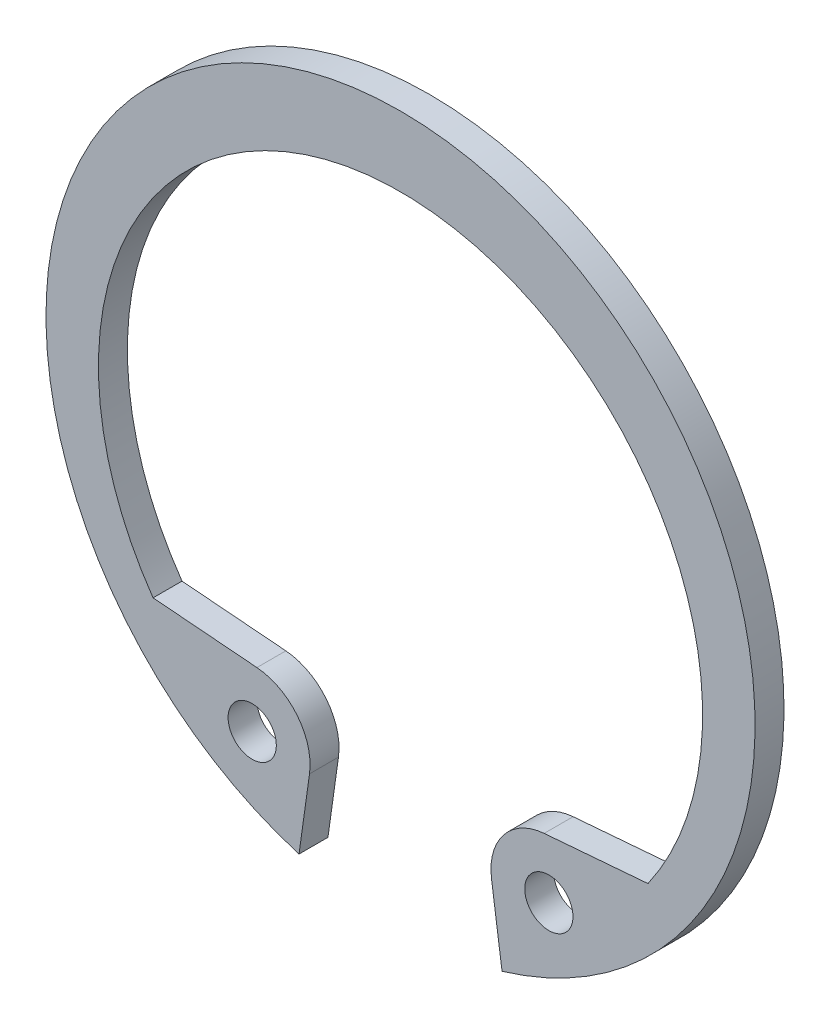
ISO-10303-21;
HEADER;
FILE_DESCRIPTION(('STEP AP214'),'2;1');
FILE_NAME('part.step','',(''),(''),'','','');
FILE_SCHEMA(('AUTOMOTIVE_DESIGN { 1 0 10303 214 1 1 1 1 }'));
ENDSEC;
DATA;
#1=APPLICATION_CONTEXT('core data for automotive mechanical design processes');
#2=APPLICATION_PROTOCOL_DEFINITION('international standard','automotive_design',2000,#1);
#3=PRODUCT_CONTEXT('',#1,'mechanical');
#4=PRODUCT('Part','Part','',(#3));
#5=PRODUCT_RELATED_PRODUCT_CATEGORY('part','',(#4));
#6=PRODUCT_DEFINITION_FORMATION('','',#4);
#7=PRODUCT_DEFINITION_CONTEXT('part definition',#1,'design');
#8=PRODUCT_DEFINITION('design','',#6,#7);
#9=PRODUCT_DEFINITION_SHAPE('','',#8);
#10=(LENGTH_UNIT() NAMED_UNIT(*) SI_UNIT(.MILLI.,.METRE.));
#11=(NAMED_UNIT(*) PLANE_ANGLE_UNIT() SI_UNIT($,.RADIAN.));
#12=(NAMED_UNIT(*) SI_UNIT($,.STERADIAN.) SOLID_ANGLE_UNIT());
#13=UNCERTAINTY_MEASURE_WITH_UNIT(LENGTH_MEASURE(1.E-05),#10,'distance_accuracy_value','');
#14=(GEOMETRIC_REPRESENTATION_CONTEXT(3) GLOBAL_UNCERTAINTY_ASSIGNED_CONTEXT((#13)) GLOBAL_UNIT_ASSIGNED_CONTEXT((#10,
#11,#12)) REPRESENTATION_CONTEXT('',''));
#15=CARTESIAN_POINT('',(0.,0.,0.));
#16=DIRECTION('',(0.,0.,1.));
#17=DIRECTION('',(1.,0.,0.));
#18=AXIS2_PLACEMENT_3D('',#15,#16,#17);
#19=CARTESIAN_POINT('',(-5.95496087519933,-8.26005064882796,1.2));
#20=DIRECTION('',(-0.08126630200028,-0.996692424050268,0.));
#21=DIRECTION('',(0.996692424050268,-0.08126630200028,0.));
#22=AXIS2_PLACEMENT_3D('',#19,#20,#21);
#23=PLANE('',#22);
#24=DIRECTION('',(-0.996692424050268,0.08126630200028,0.));
#25=VECTOR('',#24,1.);
#26=CARTESIAN_POINT('',(-5.95496087519933,-8.26005064882796,0.));
#27=LINE('',#26,#25);
#28=CARTESIAN_POINT('',(-5.95496087519933,-8.26005064882795,0.));
#29=VERTEX_POINT('',#28);
#30=CARTESIAN_POINT('',(-10.2598793547196,-7.90904486529684,0.));
#31=VERTEX_POINT('',#30);
#32=EDGE_CURVE('E98',#29,#31,#27,.T.);
#33=ORIENTED_EDGE('',*,*,#32,.T.);
#34=DIRECTION('',(0.,0.,-1.));
#35=VECTOR('',#34,1.);
#36=CARTESIAN_POINT('',(-10.2598793547196,-7.90904486529684,1.2));
#37=LINE('',#36,#35);
#38=CARTESIAN_POINT('',(-10.2598793547196,-7.90904486529684,1.2));
#39=VERTEX_POINT('',#38);
#40=EDGE_CURVE('E11',#39,#31,#37,.T.);
#41=ORIENTED_EDGE('',*,*,#40,.F.);
#42=DIRECTION('',(-0.996692424050268,0.08126630200028,0.));
#43=VECTOR('',#42,1.);
#44=CARTESIAN_POINT('',(-5.95496087519933,-8.26005064882796,1.2));
#45=LINE('',#44,#43);
#46=CARTESIAN_POINT('',(-5.95496087519933,-8.26005064882795,1.2));
#47=VERTEX_POINT('',#46);
#48=EDGE_CURVE('E118',#47,#39,#45,.T.);
#49=ORIENTED_EDGE('',*,*,#48,.F.);
#50=DIRECTION('',(0.,0.,-1.));
#51=VECTOR('',#50,1.);
#52=CARTESIAN_POINT('',(-5.95496087519933,-8.26005064882795,1.2));
#53=LINE('',#52,#51);
#54=EDGE_CURVE('E133',#47,#29,#53,.T.);
#55=ORIENTED_EDGE('',*,*,#54,.T.);
#56=EDGE_LOOP('',(#33,#41,#49,#55));
#57=FACE_BOUND('',#56,.T.);
#58=ADVANCED_FACE('F17',(#57),#23,.F.);
#59=CARTESIAN_POINT('',(0.,-0.725,1.2));
#60=DIRECTION('',(0.,0.,-1.));
#61=DIRECTION('',(-1.,0.,0.));
#62=AXIS2_PLACEMENT_3D('',#59,#60,#61);
#63=CYLINDRICAL_SURFACE('',#62,12.525);
#64=CARTESIAN_POINT('',(0.,-0.725,0.));
#65=DIRECTION('',(0.,0.,1.));
#66=DIRECTION('',(1.,0.,0.));
#67=AXIS2_PLACEMENT_3D('',#64,#65,#66);
#68=CIRCLE('',#67,12.525);
#69=CARTESIAN_POINT('',(10.2598793547196,-7.90904486529686,0.));
#70=VERTEX_POINT('',#69);
#71=EDGE_CURVE('E92',#70,#31,#68,.T.);
#72=ORIENTED_EDGE('',*,*,#71,.F.);
#73=DIRECTION('',(0.,0.,-1.));
#74=VECTOR('',#73,1.);
#75=CARTESIAN_POINT('',(10.2598793547196,-7.90904486529686,1.2));
#76=LINE('',#75,#74);
#77=CARTESIAN_POINT('',(10.2598793547196,-7.90904486529686,1.2));
#78=VERTEX_POINT('',#77);
#79=EDGE_CURVE('E20',#78,#70,#76,.T.);
#80=ORIENTED_EDGE('',*,*,#79,.F.);
#81=CARTESIAN_POINT('',(0.,-0.725,1.2));
#82=DIRECTION('',(0.,0.,1.));
#83=DIRECTION('',(1.,0.,0.));
#84=AXIS2_PLACEMENT_3D('',#81,#82,#83);
#85=CIRCLE('',#84,12.525);
#86=EDGE_CURVE('E121',#78,#39,#85,.T.);
#87=ORIENTED_EDGE('',*,*,#86,.T.);
#88=ORIENTED_EDGE('',*,*,#40,.T.);
#89=EDGE_LOOP('',(#72,#80,#87,#88));
#90=FACE_BOUND('',#89,.T.);
#91=ADVANCED_FACE('F93',(#90),#63,.F.);
#92=CARTESIAN_POINT('',(5.95496087519933,-8.26005064882795,1.2));
#93=DIRECTION('',(-0.0812663020002773,0.996692424050268,0.));
#94=DIRECTION('',(-0.996692424050268,-0.0812663020002773,0.));
#95=AXIS2_PLACEMENT_3D('',#92,#93,#94);
#96=PLANE('',#95);
#97=DIRECTION('',(0.996692424050268,0.0812663020002773,0.));
#98=VECTOR('',#97,1.);
#99=CARTESIAN_POINT('',(5.95496087519933,-8.26005064882795,0.));
#100=LINE('',#99,#98);
#101=CARTESIAN_POINT('',(5.95496087519933,-8.26005064882795,0.));
#102=VERTEX_POINT('',#101);
#103=EDGE_CURVE('E84',#102,#70,#100,.T.);
#104=ORIENTED_EDGE('',*,*,#103,.F.);
#105=DIRECTION('',(0.,0.,-1.));
#106=VECTOR('',#105,1.);
#107=CARTESIAN_POINT('',(5.95496087519933,-8.26005064882795,1.2));
#108=LINE('',#107,#106);
#109=CARTESIAN_POINT('',(5.95496087519933,-8.26005064882795,1.2));
#110=VERTEX_POINT('',#109);
#111=EDGE_CURVE('E90',#110,#102,#108,.T.);
#112=ORIENTED_EDGE('',*,*,#111,.F.);
#113=DIRECTION('',(0.996692424050268,0.0812663020002773,0.));
#114=VECTOR('',#113,1.);
#115=CARTESIAN_POINT('',(5.95496087519933,-8.26005064882795,1.2));
#116=LINE('',#115,#114);
#117=EDGE_CURVE('E86',#110,#78,#116,.T.);
#118=ORIENTED_EDGE('',*,*,#117,.T.);
#119=ORIENTED_EDGE('',*,*,#79,.T.);
#120=EDGE_LOOP('',(#104,#112,#118,#119));
#121=FACE_BOUND('',#120,.T.);
#122=ADVANCED_FACE('F82',(#121),#96,.T.);
#123=CARTESIAN_POINT('',(6.15,-10.6521124665486,1.2));
#124=DIRECTION('',(0.,0.,-1.));
#125=DIRECTION('',(-1.,0.,0.));
#126=AXIS2_PLACEMENT_3D('',#123,#124,#125);
#127=CYLINDRICAL_SURFACE('',#126,2.4);
#128=CARTESIAN_POINT('',(6.15,-10.6521124665486,0.));
#129=DIRECTION('',(0.,0.,1.));
#130=DIRECTION('',(1.,0.,0.));
#131=AXIS2_PLACEMENT_3D('',#128,#129,#130);
#132=CIRCLE('',#131,2.4);
#133=CARTESIAN_POINT('',(3.77335663502023,-10.9861279088527,0.));
#134=VERTEX_POINT('',#133);
#135=EDGE_CURVE('E103',#102,#134,#132,.T.);
#136=ORIENTED_EDGE('',*,*,#135,.T.);
#137=DIRECTION('',(0.,0.,-1.));
#138=VECTOR('',#137,1.);
#139=CARTESIAN_POINT('',(3.77335663502023,-10.9861279088527,1.2));
#140=LINE('',#139,#138);
#141=CARTESIAN_POINT('',(3.77335663502023,-10.9861279088527,1.2));
#142=VERTEX_POINT('',#141);
#143=EDGE_CURVE('E143',#142,#134,#140,.T.);
#144=ORIENTED_EDGE('',*,*,#143,.F.);
#145=CARTESIAN_POINT('',(6.15,-10.6521124665486,1.2));
#146=DIRECTION('',(0.,0.,1.));
#147=DIRECTION('',(1.,0.,0.));
#148=AXIS2_PLACEMENT_3D('',#145,#146,#147);
#149=CIRCLE('',#148,2.4);
#150=EDGE_CURVE('E124',#110,#142,#149,.T.);
#151=ORIENTED_EDGE('',*,*,#150,.F.);
#152=ORIENTED_EDGE('',*,*,#111,.T.);
#153=EDGE_LOOP('',(#136,#144,#151,#152));
#154=FACE_BOUND('',#153,.T.);
#155=ADVANCED_FACE('F148',(#154),#127,.T.);
#156=CARTESIAN_POINT('',(3.77335663502023,-10.9861279088527,1.2));
#157=DIRECTION('',(0.99026806874157,0.139173100960064,0.));
#158=DIRECTION('',(-0.139173100960064,0.990268068741571,0.));
#159=AXIS2_PLACEMENT_3D('',#156,#157,#158);
#160=PLANE('',#159);
#161=DIRECTION('',(0.139173100960064,-0.990268068741571,0.));
#162=VECTOR('',#161,1.);
#163=CARTESIAN_POINT('',(3.77335663502023,-10.9861279088527,0.));
#164=LINE('',#163,#162);
#165=CARTESIAN_POINT('',(4.20881796120529,-14.0845962444592,0.));
#166=VERTEX_POINT('',#165);
#167=EDGE_CURVE('E105',#134,#166,#164,.T.);
#168=ORIENTED_EDGE('',*,*,#167,.T.);
#169=DIRECTION('',(0.,0.,-1.));
#170=VECTOR('',#169,1.);
#171=CARTESIAN_POINT('',(4.20881796120529,-14.0845962444592,1.2));
#172=LINE('',#171,#170);
#173=CARTESIAN_POINT('',(4.20881796120529,-14.0845962444592,1.2));
#174=VERTEX_POINT('',#173);
#175=EDGE_CURVE('E140',#174,#166,#172,.T.);
#176=ORIENTED_EDGE('',*,*,#175,.F.);
#177=DIRECTION('',(0.139173100960064,-0.990268068741571,0.));
#178=VECTOR('',#177,1.);
#179=CARTESIAN_POINT('',(3.77335663502023,-10.9861279088527,1.2));
#180=LINE('',#179,#178);
#181=EDGE_CURVE('E126',#142,#174,#180,.T.);
#182=ORIENTED_EDGE('',*,*,#181,.F.);
#183=ORIENTED_EDGE('',*,*,#143,.T.);
#184=EDGE_LOOP('',(#168,#176,#182,#183));
#185=FACE_BOUND('',#184,.T.);
#186=ADVANCED_FACE('F164',(#185),#160,.F.);
#187=CARTESIAN_POINT('',(0.,0.,1.2));
#188=DIRECTION('',(0.,0.,-1.));
#189=DIRECTION('',(-1.,0.,0.));
#190=AXIS2_PLACEMENT_3D('',#187,#188,#189);
#191=CYLINDRICAL_SURFACE('',#190,14.7);
#192=CARTESIAN_POINT('',(0.,0.,0.));
#193=DIRECTION('',(0.,0.,1.));
#194=DIRECTION('',(1.,0.,0.));
#195=AXIS2_PLACEMENT_3D('',#192,#193,#194);
#196=CIRCLE('',#195,14.7);
#197=CARTESIAN_POINT('',(-4.20881796120528,-14.0845962444593,0.));
#198=VERTEX_POINT('',#197);
#199=EDGE_CURVE('E110',#166,#198,#196,.T.);
#200=ORIENTED_EDGE('',*,*,#199,.T.);
#201=DIRECTION('',(0.,0.,-1.));
#202=VECTOR('',#201,1.);
#203=CARTESIAN_POINT('',(-4.20881796120528,-14.0845962444593,1.2));
#204=LINE('',#203,#202);
#205=CARTESIAN_POINT('',(-4.20881796120528,-14.0845962444593,1.2));
#206=VERTEX_POINT('',#205);
#207=EDGE_CURVE('E138',#206,#198,#204,.T.);
#208=ORIENTED_EDGE('',*,*,#207,.F.);
#209=CARTESIAN_POINT('',(0.,0.,1.2));
#210=DIRECTION('',(0.,0.,1.));
#211=DIRECTION('',(1.,0.,0.));
#212=AXIS2_PLACEMENT_3D('',#209,#210,#211);
#213=CIRCLE('',#212,14.7);
#214=EDGE_CURVE('E128',#174,#206,#213,.T.);
#215=ORIENTED_EDGE('',*,*,#214,.F.);
#216=ORIENTED_EDGE('',*,*,#175,.T.);
#217=EDGE_LOOP('',(#200,#208,#215,#216));
#218=FACE_BOUND('',#217,.T.);
#219=ADVANCED_FACE('F161',(#218),#191,.T.);
#220=CARTESIAN_POINT('',(-3.77335663502023,-10.9861279088527,1.2));
#221=DIRECTION('',(0.99026806874157,-0.139173100960067,0.));
#222=DIRECTION('',(0.139173100960067,0.99026806874157,0.));
#223=AXIS2_PLACEMENT_3D('',#220,#221,#222);
#224=PLANE('',#223);
#225=DIRECTION('',(-0.139173100960067,-0.99026806874157,0.));
#226=VECTOR('',#225,1.);
#227=CARTESIAN_POINT('',(-3.77335663502023,-10.9861279088527,0.));
#228=LINE('',#227,#226);
#229=CARTESIAN_POINT('',(-3.77335663502023,-10.9861279088527,0.));
#230=VERTEX_POINT('',#229);
#231=EDGE_CURVE('E113',#230,#198,#228,.T.);
#232=ORIENTED_EDGE('',*,*,#231,.F.);
#233=DIRECTION('',(0.,0.,-1.));
#234=VECTOR('',#233,1.);
#235=CARTESIAN_POINT('',(-3.77335663502023,-10.9861279088527,1.2));
#236=LINE('',#235,#234);
#237=CARTESIAN_POINT('',(-3.77335663502023,-10.9861279088527,1.2));
#238=VERTEX_POINT('',#237);
#239=EDGE_CURVE('E39',#238,#230,#236,.T.);
#240=ORIENTED_EDGE('',*,*,#239,.F.);
#241=DIRECTION('',(-0.139173100960067,-0.99026806874157,0.));
#242=VECTOR('',#241,1.);
#243=CARTESIAN_POINT('',(-3.77335663502023,-10.9861279088527,1.2));
#244=LINE('',#243,#242);
#245=EDGE_CURVE('E130',#238,#206,#244,.T.);
#246=ORIENTED_EDGE('',*,*,#245,.T.);
#247=ORIENTED_EDGE('',*,*,#207,.T.);
#248=EDGE_LOOP('',(#232,#240,#246,#247));
#249=FACE_BOUND('',#248,.T.);
#250=ADVANCED_FACE('F157',(#249),#224,.T.);
#251=CARTESIAN_POINT('',(-6.15,-10.6521124665486,1.2));
#252=DIRECTION('',(0.,0.,-1.));
#253=DIRECTION('',(-1.,0.,0.));
#254=AXIS2_PLACEMENT_3D('',#251,#252,#253);
#255=CYLINDRICAL_SURFACE('',#254,2.4);
#256=CARTESIAN_POINT('',(-6.15,-10.6521124665486,0.));
#257=DIRECTION('',(0.,0.,1.));
#258=DIRECTION('',(1.,0.,0.));
#259=AXIS2_PLACEMENT_3D('',#256,#257,#258);
#260=CIRCLE('',#259,2.4);
#261=EDGE_CURVE('E116',#230,#29,#260,.T.);
#262=ORIENTED_EDGE('',*,*,#261,.T.);
#263=ORIENTED_EDGE('',*,*,#54,.F.);
#264=CARTESIAN_POINT('',(-6.15,-10.6521124665486,1.2));
#265=DIRECTION('',(0.,0.,1.));
#266=DIRECTION('',(1.,0.,0.));
#267=AXIS2_PLACEMENT_3D('',#264,#265,#266);
#268=CIRCLE('',#267,2.4);
#269=EDGE_CURVE('E31',#238,#47,#268,.T.);
#270=ORIENTED_EDGE('',*,*,#269,.F.);
#271=ORIENTED_EDGE('',*,*,#239,.T.);
#272=EDGE_LOOP('',(#262,#263,#270,#271));
#273=FACE_BOUND('',#272,.T.);
#274=ADVANCED_FACE('F213',(#273),#255,.T.);
#275=CARTESIAN_POINT('',(0.,-0.725,1.2));
#276=DIRECTION('',(0.,0.,1.));
#277=DIRECTION('',(1.,0.,0.));
#278=AXIS2_PLACEMENT_3D('',#275,#276,#277);
#279=PLANE('',#278);
#280=CARTESIAN_POINT('',(6.15,-10.6521124665486,1.2));
#281=DIRECTION('',(0.,0.,-1.));
#282=DIRECTION('',(0.,1.,0.));
#283=AXIS2_PLACEMENT_3D('',#280,#281,#282);
#284=CIRCLE('',#283,1.);
#285=CARTESIAN_POINT('',(6.15,-9.6521124665486,1.2));
#286=VERTEX_POINT('',#285);
#287=EDGE_CURVE('E268',#286,#286,#284,.T.);
#288=ORIENTED_EDGE('',*,*,#287,.T.);
#289=EDGE_LOOP('',(#288));
#290=FACE_BOUND('',#289,.T.);
#291=CARTESIAN_POINT('',(-6.15,-10.6521124665486,1.2));
#292=DIRECTION('',(0.,0.,-1.));
#293=DIRECTION('',(0.,1.,0.));
#294=AXIS2_PLACEMENT_3D('',#291,#292,#293);
#295=CIRCLE('',#294,1.);
#296=CARTESIAN_POINT('',(-6.15,-9.6521124665486,1.2));
#297=VERTEX_POINT('',#296);
#298=EDGE_CURVE('E120',#297,#297,#295,.T.);
#299=ORIENTED_EDGE('',*,*,#298,.T.);
#300=EDGE_LOOP('',(#299));
#301=FACE_BOUND('',#300,.T.);
#302=ORIENTED_EDGE('',*,*,#48,.T.);
#303=ORIENTED_EDGE('',*,*,#86,.F.);
#304=ORIENTED_EDGE('',*,*,#117,.F.);
#305=ORIENTED_EDGE('',*,*,#150,.T.);
#306=ORIENTED_EDGE('',*,*,#181,.T.);
#307=ORIENTED_EDGE('',*,*,#214,.T.);
#308=ORIENTED_EDGE('',*,*,#245,.F.);
#309=ORIENTED_EDGE('',*,*,#269,.T.);
#310=EDGE_LOOP('',(#302,#303,#304,#305,#306,#307,#308,#309));
#311=FACE_BOUND('',#310,.T.);
#312=ADVANCED_FACE('F151',(#290,#301,#311),#279,.T.);
#313=CARTESIAN_POINT('',(0.,-0.725,0.));
#314=DIRECTION('',(0.,0.,1.));
#315=DIRECTION('',(1.,0.,0.));
#316=AXIS2_PLACEMENT_3D('',#313,#314,#315);
#317=PLANE('',#316);
#318=CARTESIAN_POINT('',(6.15,-10.6521124665486,0.));
#319=DIRECTION('',(0.,0.,1.));
#320=DIRECTION('',(0.,1.,0.));
#321=AXIS2_PLACEMENT_3D('',#318,#319,#320);
#322=CIRCLE('',#321,1.);
#323=CARTESIAN_POINT('',(6.15,-9.6521124665486,0.));
#324=VERTEX_POINT('',#323);
#325=EDGE_CURVE('E271',#324,#324,#322,.T.);
#326=ORIENTED_EDGE('',*,*,#325,.T.);
#327=EDGE_LOOP('',(#326));
#328=FACE_BOUND('',#327,.T.);
#329=CARTESIAN_POINT('',(-6.15,-10.6521124665486,0.));
#330=DIRECTION('',(0.,0.,1.));
#331=DIRECTION('',(0.,1.,0.));
#332=AXIS2_PLACEMENT_3D('',#329,#330,#331);
#333=CIRCLE('',#332,1.);
#334=CARTESIAN_POINT('',(-6.15,-9.6521124665486,0.));
#335=VERTEX_POINT('',#334);
#336=EDGE_CURVE('E273',#335,#335,#333,.T.);
#337=ORIENTED_EDGE('',*,*,#336,.T.);
#338=EDGE_LOOP('',(#337));
#339=FACE_BOUND('',#338,.T.);
#340=ORIENTED_EDGE('',*,*,#32,.F.);
#341=ORIENTED_EDGE('',*,*,#261,.F.);
#342=ORIENTED_EDGE('',*,*,#231,.T.);
#343=ORIENTED_EDGE('',*,*,#199,.F.);
#344=ORIENTED_EDGE('',*,*,#167,.F.);
#345=ORIENTED_EDGE('',*,*,#135,.F.);
#346=ORIENTED_EDGE('',*,*,#103,.T.);
#347=ORIENTED_EDGE('',*,*,#71,.T.);
#348=EDGE_LOOP('',(#340,#341,#342,#343,#344,#345,#346,#347));
#349=FACE_BOUND('',#348,.T.);
#350=ADVANCED_FACE('F101',(#328,#339,#349),#317,.F.);
#351=CARTESIAN_POINT('',(-6.15,-10.6521124665486,0.));
#352=DIRECTION('',(0.,0.,1.));
#353=DIRECTION('',(0.,1.,0.));
#354=AXIS2_PLACEMENT_3D('',#351,#352,#353);
#355=CYLINDRICAL_SURFACE('',#354,1.);
#356=ORIENTED_EDGE('',*,*,#298,.F.);
#357=EDGE_LOOP('',(#356));
#358=FACE_BOUND('',#357,.T.);
#359=ORIENTED_EDGE('',*,*,#336,.F.);
#360=EDGE_LOOP('',(#359));
#361=FACE_BOUND('',#360,.T.);
#362=ADVANCED_FACE('F239',(#358,#361),#355,.F.);
#363=CARTESIAN_POINT('',(6.15,-10.6521124665486,0.));
#364=DIRECTION('',(0.,0.,1.));
#365=DIRECTION('',(0.,1.,0.));
#366=AXIS2_PLACEMENT_3D('',#363,#364,#365);
#367=CYLINDRICAL_SURFACE('',#366,1.);
#368=ORIENTED_EDGE('',*,*,#287,.F.);
#369=EDGE_LOOP('',(#368));
#370=FACE_BOUND('',#369,.T.);
#371=ORIENTED_EDGE('',*,*,#325,.F.);
#372=EDGE_LOOP('',(#371));
#373=FACE_BOUND('',#372,.T.);
#374=ADVANCED_FACE('F249',(#370,#373),#367,.F.);
#375=CLOSED_SHELL('',(#58,#91,#122,#155,#186,#219,#250,#274,#312,#350,#362,#374));
#376=MANIFOLD_SOLID_BREP('B1',#375);
#377=ADVANCED_BREP_SHAPE_REPRESENTATION('',(#18,#376),#14);
#378=SHAPE_DEFINITION_REPRESENTATION(#9,#377);
ENDSEC;
END-ISO-10303-21;
